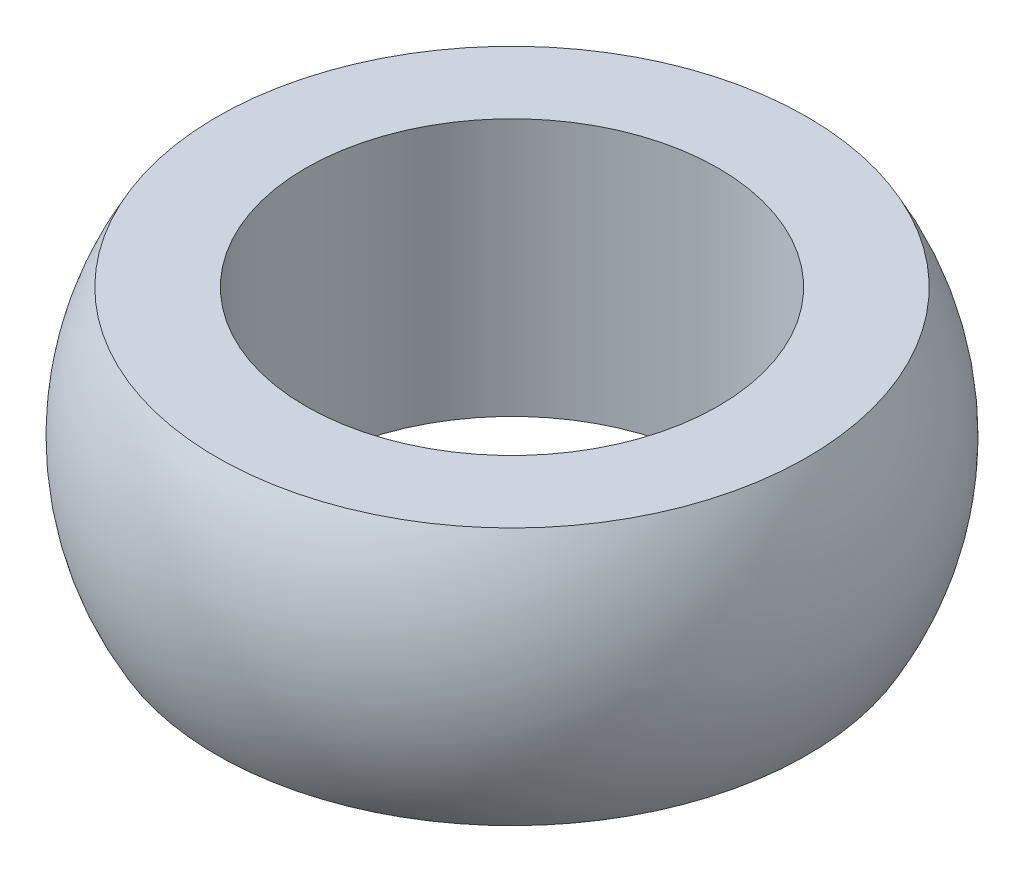
ISO-10303-21;
HEADER;
FILE_DESCRIPTION(('STEP AP214'),'2;1');
FILE_NAME('part.step','',(''),(''),'','','');
FILE_SCHEMA(('AUTOMOTIVE_DESIGN { 1 0 10303 214 1 1 1 1 }'));
ENDSEC;
DATA;
#1=APPLICATION_CONTEXT('core data for automotive mechanical design processes');
#2=APPLICATION_PROTOCOL_DEFINITION('international standard','automotive_design',2000,#1);
#3=PRODUCT_CONTEXT('',#1,'mechanical');
#4=PRODUCT('Part','Part','',(#3));
#5=PRODUCT_RELATED_PRODUCT_CATEGORY('part','',(#4));
#6=PRODUCT_DEFINITION_FORMATION('','',#4);
#7=PRODUCT_DEFINITION_CONTEXT('part definition',#1,'design');
#8=PRODUCT_DEFINITION('design','',#6,#7);
#9=PRODUCT_DEFINITION_SHAPE('','',#8);
#10=(LENGTH_UNIT() NAMED_UNIT(*) SI_UNIT(.MILLI.,.METRE.));
#11=(NAMED_UNIT(*) PLANE_ANGLE_UNIT() SI_UNIT($,.RADIAN.));
#12=(NAMED_UNIT(*) SI_UNIT($,.STERADIAN.) SOLID_ANGLE_UNIT());
#13=UNCERTAINTY_MEASURE_WITH_UNIT(LENGTH_MEASURE(1.E-05),#10,'distance_accuracy_value','');
#14=(GEOMETRIC_REPRESENTATION_CONTEXT(3) GLOBAL_UNCERTAINTY_ASSIGNED_CONTEXT((#13)) GLOBAL_UNIT_ASSIGNED_CONTEXT((#10,
#11,#12)) REPRESENTATION_CONTEXT('',''));
#15=CARTESIAN_POINT('',(0.,0.,0.));
#16=DIRECTION('',(0.,0.,1.));
#17=DIRECTION('',(1.,0.,0.));
#18=AXIS2_PLACEMENT_3D('',#15,#16,#17);
#19=CARTESIAN_POINT('',(0.,0.,0.));
#20=DIRECTION('',(0.,-1.,0.));
#21=DIRECTION('',(0.,0.,-1.));
#22=AXIS2_PLACEMENT_3D('',#19,#20,#21);
#23=CYLINDRICAL_SURFACE('',#22,12.);
#24=CARTESIAN_POINT('',(0.,-7.5,0.));
#25=DIRECTION('',(0.,-1.,0.));
#26=DIRECTION('',(0.,0.,-1.));
#27=AXIS2_PLACEMENT_3D('',#24,#25,#26);
#28=CIRCLE('',#27,12.);
#29=CARTESIAN_POINT('',(0.,-7.5,-12.));
#30=VERTEX_POINT('',#29);
#31=EDGE_CURVE('E10',#30,#30,#28,.T.);
#32=ORIENTED_EDGE('',*,*,#31,.T.);
#33=EDGE_LOOP('',(#32));
#34=FACE_BOUND('',#33,.T.);
#35=CARTESIAN_POINT('',(0.,7.5,0.));
#36=DIRECTION('',(0.,-1.,0.));
#37=DIRECTION('',(0.,0.,-1.));
#38=AXIS2_PLACEMENT_3D('',#35,#36,#37);
#39=CIRCLE('',#38,12.);
#40=CARTESIAN_POINT('',(0.,7.5,-12.));
#41=VERTEX_POINT('',#40);
#42=EDGE_CURVE('E54',#41,#41,#39,.T.);
#43=ORIENTED_EDGE('',*,*,#42,.F.);
#44=EDGE_LOOP('',(#43));
#45=FACE_BOUND('',#44,.T.);
#46=ADVANCED_FACE('F37',(#34,#45),#23,.F.);
#47=CARTESIAN_POINT('',(12.,-7.5,0.));
#48=DIRECTION('',(0.,-1.,0.));
#49=DIRECTION('',(0.,0.,-1.));
#50=AXIS2_PLACEMENT_3D('',#47,#48,#49);
#51=PLANE('',#50);
#52=CARTESIAN_POINT('',(0.,-7.5,0.));
#53=DIRECTION('',(0.,-1.,0.));
#54=DIRECTION('',(0.,0.,-1.));
#55=AXIS2_PLACEMENT_3D('',#52,#53,#54);
#56=CIRCLE('',#55,17.1665005681985);
#57=CARTESIAN_POINT('',(0.,-7.5,-17.1665005681985));
#58=VERTEX_POINT('',#57);
#59=EDGE_CURVE('E44',#58,#58,#56,.T.);
#60=ORIENTED_EDGE('',*,*,#59,.T.);
#61=EDGE_LOOP('',(#60));
#62=FACE_BOUND('',#61,.T.);
#63=ORIENTED_EDGE('',*,*,#31,.F.);
#64=EDGE_LOOP('',(#63));
#65=FACE_BOUND('',#64,.T.);
#66=ADVANCED_FACE('F65',(#62,#65),#51,.T.);
#67=CARTESIAN_POINT('',(0.,0.,0.));
#68=DIRECTION('',(0.,-1.,0.));
#69=DIRECTION('',(0.,0.,-1.));
#70=AXIS2_PLACEMENT_3D('',#67,#68,#69);
#71=DEGENERATE_TOROIDAL_SURFACE('',#70,4.17611951143189,15.,.T.);
#72=CARTESIAN_POINT('',(0.,7.5,0.));
#73=DIRECTION('',(0.,-1.,0.));
#74=DIRECTION('',(0.,0.,-1.));
#75=AXIS2_PLACEMENT_3D('',#72,#73,#74);
#76=CIRCLE('',#75,17.1665005681985);
#77=CARTESIAN_POINT('',(0.,7.5,-17.1665005681985));
#78=VERTEX_POINT('',#77);
#79=EDGE_CURVE('E49',#78,#78,#76,.T.);
#80=ORIENTED_EDGE('',*,*,#79,.T.);
#81=EDGE_LOOP('',(#80));
#82=FACE_BOUND('',#81,.T.);
#83=ORIENTED_EDGE('',*,*,#59,.F.);
#84=EDGE_LOOP('',(#83));
#85=FACE_BOUND('',#84,.T.);
#86=ADVANCED_FACE('F69',(#82,#85),#71,.T.);
#87=CARTESIAN_POINT('',(12.,7.5,0.));
#88=DIRECTION('',(0.,1.,0.));
#89=DIRECTION('',(0.,0.,1.));
#90=AXIS2_PLACEMENT_3D('',#87,#88,#89);
#91=PLANE('',#90);
#92=ORIENTED_EDGE('',*,*,#42,.T.);
#93=EDGE_LOOP('',(#92));
#94=FACE_BOUND('',#93,.T.);
#95=ORIENTED_EDGE('',*,*,#79,.F.);
#96=EDGE_LOOP('',(#95));
#97=FACE_BOUND('',#96,.T.);
#98=ADVANCED_FACE('F61',(#94,#97),#91,.T.);
#99=CLOSED_SHELL('',(#46,#66,#86,#98));
#100=MANIFOLD_SOLID_BREP('B2',#99);
#101=ADVANCED_BREP_SHAPE_REPRESENTATION('',(#18,#100),#14);
#102=SHAPE_DEFINITION_REPRESENTATION(#9,#101);
ENDSEC;
END-ISO-10303-21;
